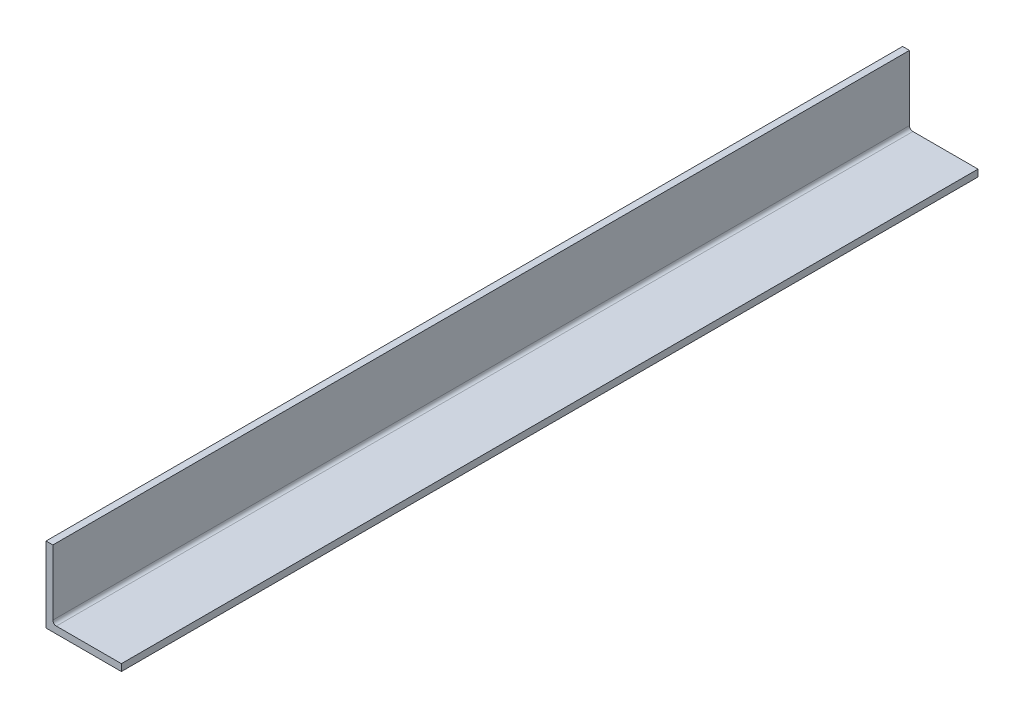
ISO-10303-21;
HEADER;
FILE_DESCRIPTION(('STEP AP214'),'2;1');
FILE_NAME('part.step','',(''),(''),'','','');
FILE_SCHEMA(('AUTOMOTIVE_DESIGN { 1 0 10303 214 1 1 1 1 }'));
ENDSEC;
DATA;
#1=APPLICATION_CONTEXT('core data for automotive mechanical design processes');
#2=APPLICATION_PROTOCOL_DEFINITION('international standard','automotive_design',2000,#1);
#3=PRODUCT_CONTEXT('',#1,'mechanical');
#4=PRODUCT('Part','Part','',(#3));
#5=PRODUCT_RELATED_PRODUCT_CATEGORY('part','',(#4));
#6=PRODUCT_DEFINITION_FORMATION('','',#4);
#7=PRODUCT_DEFINITION_CONTEXT('part definition',#1,'design');
#8=PRODUCT_DEFINITION('design','',#6,#7);
#9=PRODUCT_DEFINITION_SHAPE('','',#8);
#10=(LENGTH_UNIT() NAMED_UNIT(*) SI_UNIT(.MILLI.,.METRE.));
#11=(NAMED_UNIT(*) PLANE_ANGLE_UNIT() SI_UNIT($,.RADIAN.));
#12=(NAMED_UNIT(*) SI_UNIT($,.STERADIAN.) SOLID_ANGLE_UNIT());
#13=UNCERTAINTY_MEASURE_WITH_UNIT(LENGTH_MEASURE(1.E-05),#10,'distance_accuracy_value','');
#14=(GEOMETRIC_REPRESENTATION_CONTEXT(3) GLOBAL_UNCERTAINTY_ASSIGNED_CONTEXT((#13)) GLOBAL_UNIT_ASSIGNED_CONTEXT((#10,
#11,#12)) REPRESENTATION_CONTEXT('',''));
#15=CARTESIAN_POINT('',(0.,0.,0.));
#16=DIRECTION('',(0.,0.,1.));
#17=DIRECTION('',(1.,0.,0.));
#18=AXIS2_PLACEMENT_3D('',#15,#16,#17);
#19=CARTESIAN_POINT('',(0.,40.,250.));
#20=DIRECTION('',(0.,-1.,0.));
#21=DIRECTION('',(0.,0.,-1.));
#22=AXIS2_PLACEMENT_3D('',#19,#20,#21);
#23=PLANE('',#22);
#24=DIRECTION('',(-1.,0.,0.));
#25=VECTOR('',#24,1.);
#26=CARTESIAN_POINT('',(0.,40.,-250.));
#27=LINE('',#26,#25);
#28=CARTESIAN_POINT('',(0.,40.,-250.));
#29=VERTEX_POINT('',#28);
#30=CARTESIAN_POINT('',(-4.,40.,-250.));
#31=VERTEX_POINT('',#30);
#32=EDGE_CURVE('E123',#29,#31,#27,.T.);
#33=ORIENTED_EDGE('',*,*,#32,.T.);
#34=DIRECTION('',(0.,0.,-1.));
#35=VECTOR('',#34,1.);
#36=CARTESIAN_POINT('',(-4.,40.,250.));
#37=LINE('',#36,#35);
#38=CARTESIAN_POINT('',(-4.,40.,250.));
#39=VERTEX_POINT('',#38);
#40=EDGE_CURVE('E11',#39,#31,#37,.T.);
#41=ORIENTED_EDGE('',*,*,#40,.F.);
#42=DIRECTION('',(-1.,0.,0.));
#43=VECTOR('',#42,1.);
#44=CARTESIAN_POINT('',(0.,40.,250.));
#45=LINE('',#44,#43);
#46=CARTESIAN_POINT('',(0.,40.,250.));
#47=VERTEX_POINT('',#46);
#48=EDGE_CURVE('E135',#47,#39,#45,.T.);
#49=ORIENTED_EDGE('',*,*,#48,.F.);
#50=DIRECTION('',(0.,0.,-1.));
#51=VECTOR('',#50,1.);
#52=CARTESIAN_POINT('',(0.,40.,250.));
#53=LINE('',#52,#51);
#54=EDGE_CURVE('E119',#47,#29,#53,.T.);
#55=ORIENTED_EDGE('',*,*,#54,.T.);
#56=EDGE_LOOP('',(#33,#41,#49,#55));
#57=FACE_BOUND('',#56,.T.);
#58=ADVANCED_FACE('F33',(#57),#23,.F.);
#59=CARTESIAN_POINT('',(-4.,-4.,250.));
#60=DIRECTION('',(1.,0.,0.));
#61=DIRECTION('',(0.,0.,-1.));
#62=AXIS2_PLACEMENT_3D('',#59,#60,#61);
#63=PLANE('',#62);
#64=DIRECTION('',(0.,-1.,0.));
#65=VECTOR('',#64,1.);
#66=CARTESIAN_POINT('',(-4.,-4.,-250.));
#67=LINE('',#66,#65);
#68=CARTESIAN_POINT('',(-4.,-4.,-250.));
#69=VERTEX_POINT('',#68);
#70=EDGE_CURVE('E126',#31,#69,#67,.T.);
#71=ORIENTED_EDGE('',*,*,#70,.T.);
#72=DIRECTION('',(0.,0.,-1.));
#73=VECTOR('',#72,1.);
#74=CARTESIAN_POINT('',(-4.,-4.,250.));
#75=LINE('',#74,#73);
#76=CARTESIAN_POINT('',(-4.,-4.,250.));
#77=VERTEX_POINT('',#76);
#78=EDGE_CURVE('E41',#77,#69,#75,.T.);
#79=ORIENTED_EDGE('',*,*,#78,.F.);
#80=DIRECTION('',(0.,-1.,0.));
#81=VECTOR('',#80,1.);
#82=CARTESIAN_POINT('',(-4.,-4.,250.));
#83=LINE('',#82,#81);
#84=EDGE_CURVE('E89',#39,#77,#83,.T.);
#85=ORIENTED_EDGE('',*,*,#84,.F.);
#86=ORIENTED_EDGE('',*,*,#40,.T.);
#87=EDGE_LOOP('',(#71,#79,#85,#86));
#88=FACE_BOUND('',#87,.T.);
#89=ADVANCED_FACE('F160',(#88),#63,.F.);
#90=CARTESIAN_POINT('',(-4.,-4.,250.));
#91=DIRECTION('',(0.,1.,0.));
#92=DIRECTION('',(0.,0.,1.));
#93=AXIS2_PLACEMENT_3D('',#90,#91,#92);
#94=PLANE('',#93);
#95=DIRECTION('',(1.,0.,0.));
#96=VECTOR('',#95,1.);
#97=CARTESIAN_POINT('',(-4.,-4.,-250.));
#98=LINE('',#97,#96);
#99=CARTESIAN_POINT('',(40.,-4.,-250.));
#100=VERTEX_POINT('',#99);
#101=EDGE_CURVE('E128',#69,#100,#98,.T.);
#102=ORIENTED_EDGE('',*,*,#101,.T.);
#103=DIRECTION('',(0.,0.,-1.));
#104=VECTOR('',#103,1.);
#105=CARTESIAN_POINT('',(40.,-4.,250.));
#106=LINE('',#105,#104);
#107=CARTESIAN_POINT('',(40.,-4.,250.));
#108=VERTEX_POINT('',#107);
#109=EDGE_CURVE('E139',#108,#100,#106,.T.);
#110=ORIENTED_EDGE('',*,*,#109,.F.);
#111=DIRECTION('',(1.,0.,0.));
#112=VECTOR('',#111,1.);
#113=CARTESIAN_POINT('',(-4.,-4.,250.));
#114=LINE('',#113,#112);
#115=EDGE_CURVE('E147',#77,#108,#114,.T.);
#116=ORIENTED_EDGE('',*,*,#115,.F.);
#117=ORIENTED_EDGE('',*,*,#78,.T.);
#118=EDGE_LOOP('',(#102,#110,#116,#117));
#119=FACE_BOUND('',#118,.T.);
#120=ADVANCED_FACE('F145',(#119),#94,.F.);
#121=CARTESIAN_POINT('',(40.,0.,250.));
#122=DIRECTION('',(-1.,0.,0.));
#123=DIRECTION('',(0.,0.,1.));
#124=AXIS2_PLACEMENT_3D('',#121,#122,#123);
#125=PLANE('',#124);
#126=DIRECTION('',(0.,1.,0.));
#127=VECTOR('',#126,1.);
#128=CARTESIAN_POINT('',(40.,0.,-250.));
#129=LINE('',#128,#127);
#130=CARTESIAN_POINT('',(40.,0.,-250.));
#131=VERTEX_POINT('',#130);
#132=EDGE_CURVE('E130',#100,#131,#129,.T.);
#133=ORIENTED_EDGE('',*,*,#132,.T.);
#134=DIRECTION('',(0.,0.,-1.));
#135=VECTOR('',#134,1.);
#136=CARTESIAN_POINT('',(40.,0.,250.));
#137=LINE('',#136,#135);
#138=CARTESIAN_POINT('',(40.,0.,250.));
#139=VERTEX_POINT('',#138);
#140=EDGE_CURVE('E114',#139,#131,#137,.T.);
#141=ORIENTED_EDGE('',*,*,#140,.F.);
#142=DIRECTION('',(0.,1.,0.));
#143=VECTOR('',#142,1.);
#144=CARTESIAN_POINT('',(40.,0.,250.));
#145=LINE('',#144,#143);
#146=EDGE_CURVE('E105',#108,#139,#145,.T.);
#147=ORIENTED_EDGE('',*,*,#146,.F.);
#148=ORIENTED_EDGE('',*,*,#109,.T.);
#149=EDGE_LOOP('',(#133,#141,#147,#148));
#150=FACE_BOUND('',#149,.T.);
#151=ADVANCED_FACE('F153',(#150),#125,.F.);
#152=CARTESIAN_POINT('',(2.00000000000001,0.,250.));
#153=DIRECTION('',(0.,-1.,0.));
#154=DIRECTION('',(0.,0.,-1.));
#155=AXIS2_PLACEMENT_3D('',#152,#153,#154);
#156=PLANE('',#155);
#157=DIRECTION('',(-1.,0.,0.));
#158=VECTOR('',#157,1.);
#159=CARTESIAN_POINT('',(2.00000000000001,0.,-250.));
#160=LINE('',#159,#158);
#161=CARTESIAN_POINT('',(2.00000000000001,0.,-250.));
#162=VERTEX_POINT('',#161);
#163=EDGE_CURVE('E113',#131,#162,#160,.T.);
#164=ORIENTED_EDGE('',*,*,#163,.T.);
#165=DIRECTION('',(0.,0.,-1.));
#166=VECTOR('',#165,1.);
#167=CARTESIAN_POINT('',(2.00000000000001,0.,250.));
#168=LINE('',#167,#166);
#169=CARTESIAN_POINT('',(2.00000000000001,0.,250.));
#170=VERTEX_POINT('',#169);
#171=EDGE_CURVE('E110',#170,#162,#168,.T.);
#172=ORIENTED_EDGE('',*,*,#171,.F.);
#173=DIRECTION('',(-1.,0.,0.));
#174=VECTOR('',#173,1.);
#175=CARTESIAN_POINT('',(2.00000000000001,0.,250.));
#176=LINE('',#175,#174);
#177=EDGE_CURVE('E99',#139,#170,#176,.T.);
#178=ORIENTED_EDGE('',*,*,#177,.F.);
#179=ORIENTED_EDGE('',*,*,#140,.T.);
#180=EDGE_LOOP('',(#164,#172,#178,#179));
#181=FACE_BOUND('',#180,.T.);
#182=ADVANCED_FACE('F111',(#181),#156,.F.);
#183=CARTESIAN_POINT('',(2.,2.,250.));
#184=DIRECTION('',(0.,0.,-1.));
#185=DIRECTION('',(-1.,0.,0.));
#186=AXIS2_PLACEMENT_3D('',#183,#184,#185);
#187=CYLINDRICAL_SURFACE('',#186,2.);
#188=CARTESIAN_POINT('',(2.,2.,-250.));
#189=DIRECTION('',(0.,0.,-1.));
#190=DIRECTION('',(1.,0.,0.));
#191=AXIS2_PLACEMENT_3D('',#188,#189,#190);
#192=CIRCLE('',#191,2.);
#193=CARTESIAN_POINT('',(0.,2.00000000000001,-250.));
#194=VERTEX_POINT('',#193);
#195=EDGE_CURVE('E75',#162,#194,#192,.T.);
#196=ORIENTED_EDGE('',*,*,#195,.T.);
#197=DIRECTION('',(0.,0.,-1.));
#198=VECTOR('',#197,1.);
#199=CARTESIAN_POINT('',(0.,2.00000000000001,250.));
#200=LINE('',#199,#198);
#201=CARTESIAN_POINT('',(0.,2.00000000000001,250.));
#202=VERTEX_POINT('',#201);
#203=EDGE_CURVE('E115',#202,#194,#200,.T.);
#204=ORIENTED_EDGE('',*,*,#203,.F.);
#205=CARTESIAN_POINT('',(2.,2.,250.));
#206=DIRECTION('',(0.,0.,-1.));
#207=DIRECTION('',(1.,0.,0.));
#208=AXIS2_PLACEMENT_3D('',#205,#206,#207);
#209=CIRCLE('',#208,2.);
#210=EDGE_CURVE('E103',#170,#202,#209,.T.);
#211=ORIENTED_EDGE('',*,*,#210,.F.);
#212=ORIENTED_EDGE('',*,*,#171,.T.);
#213=EDGE_LOOP('',(#196,#204,#211,#212));
#214=FACE_BOUND('',#213,.T.);
#215=ADVANCED_FACE('F117',(#214),#187,.F.);
#216=CARTESIAN_POINT('',(0.,2.00000000000001,250.));
#217=DIRECTION('',(-1.,0.,0.));
#218=DIRECTION('',(0.,0.,1.));
#219=AXIS2_PLACEMENT_3D('',#216,#217,#218);
#220=PLANE('',#219);
#221=DIRECTION('',(0.,1.,0.));
#222=VECTOR('',#221,1.);
#223=CARTESIAN_POINT('',(0.,2.00000000000001,-250.));
#224=LINE('',#223,#222);
#225=EDGE_CURVE('E81',#194,#29,#224,.T.);
#226=ORIENTED_EDGE('',*,*,#225,.T.);
#227=ORIENTED_EDGE('',*,*,#54,.F.);
#228=DIRECTION('',(0.,1.,0.));
#229=VECTOR('',#228,1.);
#230=CARTESIAN_POINT('',(0.,2.00000000000001,250.));
#231=LINE('',#230,#229);
#232=EDGE_CURVE('E49',#202,#47,#231,.T.);
#233=ORIENTED_EDGE('',*,*,#232,.F.);
#234=ORIENTED_EDGE('',*,*,#203,.T.);
#235=EDGE_LOOP('',(#226,#227,#233,#234));
#236=FACE_BOUND('',#235,.T.);
#237=ADVANCED_FACE('F174',(#236),#220,.F.);
#238=CARTESIAN_POINT('',(2.,2.,250.));
#239=DIRECTION('',(0.,0.,1.));
#240=DIRECTION('',(1.,0.,0.));
#241=AXIS2_PLACEMENT_3D('',#238,#239,#240);
#242=PLANE('',#241);
#243=ORIENTED_EDGE('',*,*,#48,.T.);
#244=ORIENTED_EDGE('',*,*,#84,.T.);
#245=ORIENTED_EDGE('',*,*,#115,.T.);
#246=ORIENTED_EDGE('',*,*,#146,.T.);
#247=ORIENTED_EDGE('',*,*,#177,.T.);
#248=ORIENTED_EDGE('',*,*,#210,.T.);
#249=ORIENTED_EDGE('',*,*,#232,.T.);
#250=EDGE_LOOP('',(#243,#244,#245,#246,#247,#248,#249));
#251=FACE_BOUND('',#250,.T.);
#252=ADVANCED_FACE('F101',(#251),#242,.T.);
#253=CARTESIAN_POINT('',(2.,2.,-250.));
#254=DIRECTION('',(0.,0.,1.));
#255=DIRECTION('',(1.,0.,0.));
#256=AXIS2_PLACEMENT_3D('',#253,#254,#255);
#257=PLANE('',#256);
#258=ORIENTED_EDGE('',*,*,#32,.F.);
#259=ORIENTED_EDGE('',*,*,#225,.F.);
#260=ORIENTED_EDGE('',*,*,#195,.F.);
#261=ORIENTED_EDGE('',*,*,#163,.F.);
#262=ORIENTED_EDGE('',*,*,#132,.F.);
#263=ORIENTED_EDGE('',*,*,#101,.F.);
#264=ORIENTED_EDGE('',*,*,#70,.F.);
#265=EDGE_LOOP('',(#258,#259,#260,#261,#262,#263,#264));
#266=FACE_BOUND('',#265,.T.);
#267=ADVANCED_FACE('F151',(#266),#257,.F.);
#268=CLOSED_SHELL('',(#58,#89,#120,#151,#182,#215,#237,#252,#267));
#269=MANIFOLD_SOLID_BREP('B2',#268);
#270=ADVANCED_BREP_SHAPE_REPRESENTATION('',(#18,#269),#14);
#271=SHAPE_DEFINITION_REPRESENTATION(#9,#270);
ENDSEC;
END-ISO-10303-21;
